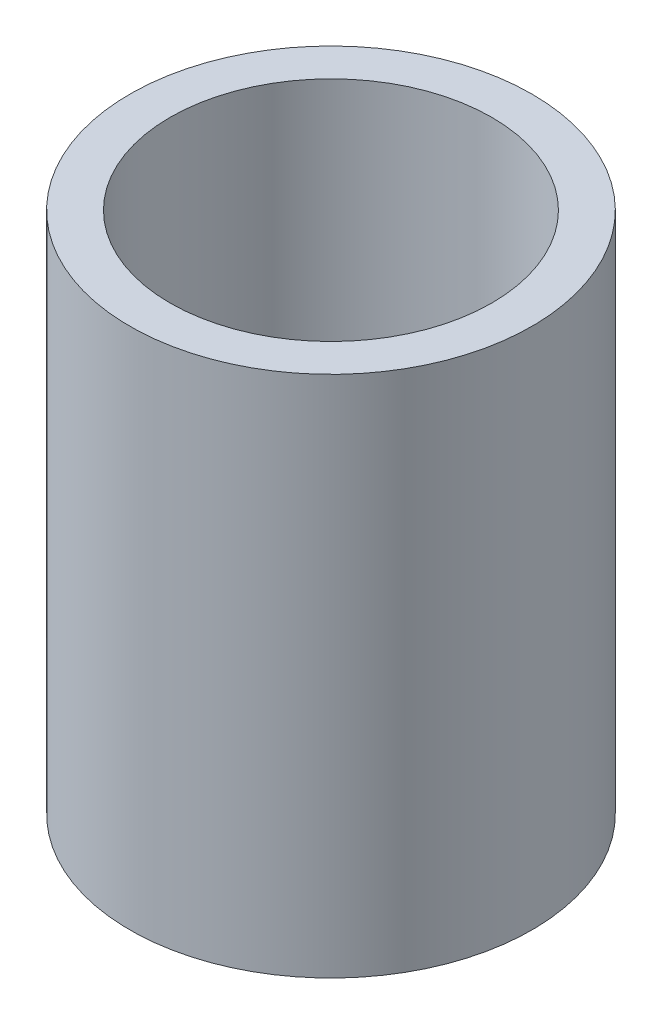
ISO-10303-21;
HEADER;
FILE_DESCRIPTION(('STEP AP214'),'2;1');
FILE_NAME('part.step','',(''),(''),'','','');
FILE_SCHEMA(('AUTOMOTIVE_DESIGN { 1 0 10303 214 1 1 1 1 }'));
ENDSEC;
DATA;
#1=APPLICATION_CONTEXT('core data for automotive mechanical design processes');
#2=APPLICATION_PROTOCOL_DEFINITION('international standard','automotive_design',2000,#1);
#3=PRODUCT_CONTEXT('',#1,'mechanical');
#4=PRODUCT('Part','Part','',(#3));
#5=PRODUCT_RELATED_PRODUCT_CATEGORY('part','',(#4));
#6=PRODUCT_DEFINITION_FORMATION('','',#4);
#7=PRODUCT_DEFINITION_CONTEXT('part definition',#1,'design');
#8=PRODUCT_DEFINITION('design','',#6,#7);
#9=PRODUCT_DEFINITION_SHAPE('','',#8);
#10=(LENGTH_UNIT() NAMED_UNIT(*) SI_UNIT(.MILLI.,.METRE.));
#11=(NAMED_UNIT(*) PLANE_ANGLE_UNIT() SI_UNIT($,.RADIAN.));
#12=(NAMED_UNIT(*) SI_UNIT($,.STERADIAN.) SOLID_ANGLE_UNIT());
#13=UNCERTAINTY_MEASURE_WITH_UNIT(LENGTH_MEASURE(1.E-05),#10,'distance_accuracy_value','');
#14=(GEOMETRIC_REPRESENTATION_CONTEXT(3) GLOBAL_UNCERTAINTY_ASSIGNED_CONTEXT((#13)) GLOBAL_UNIT_ASSIGNED_CONTEXT((#10,
#11,#12)) REPRESENTATION_CONTEXT('',''));
#15=CARTESIAN_POINT('',(0.,0.,0.));
#16=DIRECTION('',(0.,0.,1.));
#17=DIRECTION('',(1.,0.,0.));
#18=AXIS2_PLACEMENT_3D('',#15,#16,#17);
#19=CARTESIAN_POINT('',(0.,13.,0.));
#20=DIRECTION('',(0.,1.,0.));
#21=DIRECTION('',(0.,0.,1.));
#22=AXIS2_PLACEMENT_3D('',#19,#20,#21);
#23=PLANE('',#22);
#24=CARTESIAN_POINT('',(0.,13.,0.));
#25=DIRECTION('',(0.,1.,0.));
#26=DIRECTION('',(0.,0.,1.));
#27=AXIS2_PLACEMENT_3D('',#24,#25,#26);
#28=CIRCLE('',#27,5.);
#29=CARTESIAN_POINT('',(0.,13.,-5.));
#30=VERTEX_POINT('',#29);
#31=EDGE_CURVE('E10',#30,#30,#28,.T.);
#32=ORIENTED_EDGE('',*,*,#31,.T.);
#33=EDGE_LOOP('',(#32));
#34=FACE_BOUND('',#33,.T.);
#35=CARTESIAN_POINT('',(0.,13.,0.));
#36=DIRECTION('',(0.,1.,0.));
#37=DIRECTION('',(0.,0.,1.));
#38=AXIS2_PLACEMENT_3D('',#35,#36,#37);
#39=CIRCLE('',#38,4.);
#40=CARTESIAN_POINT('',(0.,13.,-4.));
#41=VERTEX_POINT('',#40);
#42=EDGE_CURVE('E41',#41,#41,#39,.T.);
#43=ORIENTED_EDGE('',*,*,#42,.F.);
#44=EDGE_LOOP('',(#43));
#45=FACE_BOUND('',#44,.T.);
#46=ADVANCED_FACE('F30',(#34,#45),#23,.T.);
#47=CARTESIAN_POINT('',(0.,0.,0.));
#48=DIRECTION('',(0.,1.,0.));
#49=DIRECTION('',(0.,0.,1.));
#50=AXIS2_PLACEMENT_3D('',#47,#48,#49);
#51=PLANE('',#50);
#52=CARTESIAN_POINT('',(0.,0.,0.));
#53=DIRECTION('',(0.,1.,0.));
#54=DIRECTION('',(0.,0.,1.));
#55=AXIS2_PLACEMENT_3D('',#52,#53,#54);
#56=CIRCLE('',#55,5.);
#57=CARTESIAN_POINT('',(0.,0.,-5.));
#58=VERTEX_POINT('',#57);
#59=EDGE_CURVE('E34',#58,#58,#56,.T.);
#60=ORIENTED_EDGE('',*,*,#59,.F.);
#61=EDGE_LOOP('',(#60));
#62=FACE_BOUND('',#61,.T.);
#63=CARTESIAN_POINT('',(0.,0.,0.));
#64=DIRECTION('',(0.,1.,0.));
#65=DIRECTION('',(0.,0.,1.));
#66=AXIS2_PLACEMENT_3D('',#63,#64,#65);
#67=CIRCLE('',#66,4.);
#68=CARTESIAN_POINT('',(0.,0.,-4.));
#69=VERTEX_POINT('',#68);
#70=EDGE_CURVE('E43',#69,#69,#67,.T.);
#71=ORIENTED_EDGE('',*,*,#70,.T.);
#72=EDGE_LOOP('',(#71));
#73=FACE_BOUND('',#72,.T.);
#74=ADVANCED_FACE('F53',(#62,#73),#51,.F.);
#75=CARTESIAN_POINT('',(0.,13.,0.));
#76=DIRECTION('',(0.,-1.,0.));
#77=DIRECTION('',(0.,0.,-1.));
#78=AXIS2_PLACEMENT_3D('',#75,#76,#77);
#79=CYLINDRICAL_SURFACE('',#78,5.);
#80=CARTESIAN_POINT('',(0.,13.,-5.));
#81=CARTESIAN_POINT('',(0.,12.8645833333333,-5.));
#82=CARTESIAN_POINT('',(0.,12.7291666666667,-5.));
#83=CARTESIAN_POINT('',(0.,12.4583333333333,-5.));
#84=CARTESIAN_POINT('',(0.,12.3229166666667,-5.));
#85=CARTESIAN_POINT('',(0.,12.0520833333333,-5.));
#86=CARTESIAN_POINT('',(0.,11.9166666666667,-5.));
#87=CARTESIAN_POINT('',(0.,11.6458333333333,-5.));
#88=CARTESIAN_POINT('',(0.,11.5104166666667,-5.));
#89=CARTESIAN_POINT('',(0.,11.2395833333333,-5.));
#90=CARTESIAN_POINT('',(0.,11.1041666666667,-5.));
#91=CARTESIAN_POINT('',(0.,10.8333333333333,-5.));
#92=CARTESIAN_POINT('',(0.,10.6979166666667,-5.));
#93=CARTESIAN_POINT('',(0.,10.4270833333333,-5.));
#94=CARTESIAN_POINT('',(0.,10.2916666666667,-5.));
#95=CARTESIAN_POINT('',(0.,10.0208333333333,-5.));
#96=CARTESIAN_POINT('',(0.,9.88541666666667,-5.));
#97=CARTESIAN_POINT('',(0.,9.61458333333333,-5.));
#98=CARTESIAN_POINT('',(0.,9.47916666666667,-5.));
#99=CARTESIAN_POINT('',(0.,9.20833333333333,-5.));
#100=CARTESIAN_POINT('',(0.,9.07291666666667,-5.));
#101=CARTESIAN_POINT('',(0.,8.80208333333333,-5.));
#102=CARTESIAN_POINT('',(0.,8.66666666666667,-5.));
#103=CARTESIAN_POINT('',(0.,8.39583333333333,-5.));
#104=CARTESIAN_POINT('',(0.,8.26041666666667,-5.));
#105=CARTESIAN_POINT('',(0.,7.98958333333333,-5.));
#106=CARTESIAN_POINT('',(0.,7.85416666666667,-5.));
#107=CARTESIAN_POINT('',(0.,7.58333333333333,-5.));
#108=CARTESIAN_POINT('',(0.,7.44791666666667,-5.));
#109=CARTESIAN_POINT('',(0.,7.17708333333333,-5.));
#110=CARTESIAN_POINT('',(0.,7.04166666666667,-5.));
#111=CARTESIAN_POINT('',(0.,6.77083333333333,-5.));
#112=CARTESIAN_POINT('',(0.,6.63541666666667,-5.));
#113=CARTESIAN_POINT('',(0.,6.36458333333333,-5.));
#114=CARTESIAN_POINT('',(0.,6.22916666666667,-5.));
#115=CARTESIAN_POINT('',(0.,5.95833333333333,-5.));
#116=CARTESIAN_POINT('',(0.,5.82291666666667,-5.));
#117=CARTESIAN_POINT('',(0.,5.55208333333333,-5.));
#118=CARTESIAN_POINT('',(0.,5.41666666666667,-5.));
#119=CARTESIAN_POINT('',(0.,5.14583333333333,-5.));
#120=CARTESIAN_POINT('',(0.,5.01041666666667,-5.));
#121=CARTESIAN_POINT('',(0.,4.73958333333333,-5.));
#122=CARTESIAN_POINT('',(0.,4.60416666666667,-5.));
#123=CARTESIAN_POINT('',(0.,4.33333333333333,-5.));
#124=CARTESIAN_POINT('',(0.,4.19791666666667,-5.));
#125=CARTESIAN_POINT('',(0.,3.92708333333333,-5.));
#126=CARTESIAN_POINT('',(0.,3.79166666666667,-5.));
#127=CARTESIAN_POINT('',(0.,3.52083333333333,-5.));
#128=CARTESIAN_POINT('',(0.,3.38541666666667,-5.));
#129=CARTESIAN_POINT('',(0.,3.11458333333333,-5.));
#130=CARTESIAN_POINT('',(0.,2.97916666666667,-5.));
#131=CARTESIAN_POINT('',(0.,2.70833333333333,-5.));
#132=CARTESIAN_POINT('',(0.,2.57291666666667,-5.));
#133=CARTESIAN_POINT('',(0.,2.30208333333333,-5.));
#134=CARTESIAN_POINT('',(0.,2.16666666666667,-5.));
#135=CARTESIAN_POINT('',(0.,1.89583333333333,-5.));
#136=CARTESIAN_POINT('',(0.,1.76041666666667,-5.));
#137=CARTESIAN_POINT('',(0.,1.48958333333333,-5.));
#138=CARTESIAN_POINT('',(0.,1.35416666666667,-5.));
#139=CARTESIAN_POINT('',(0.,1.08333333333333,-5.));
#140=CARTESIAN_POINT('',(0.,0.947916666666667,-5.));
#141=CARTESIAN_POINT('',(0.,0.677083333333334,-5.));
#142=CARTESIAN_POINT('',(0.,0.541666666666667,-5.));
#143=CARTESIAN_POINT('',(0.,0.270833333333334,-5.));
#144=CARTESIAN_POINT('',(0.,0.135416666666667,-5.));
#145=CARTESIAN_POINT('',(0.,0.,-5.));
#146=B_SPLINE_CURVE_WITH_KNOTS('',3,(#80,#81,#82,#83,#84,#85,#86,#87,#88,#89,#90,#91,#92,#93,
#94,#95,#96,#97,#98,#99,#100,#101,#102,#103,#104,#105,#106,#107,#108,#109,#110,#111,#112,#113,
#114,#115,#116,#117,#118,#119,#120,#121,#122,#123,#124,#125,#126,#127,#128,#129,#130,#131,#132,
#133,#134,#135,#136,#137,#138,#139,#140,#141,#142,#143,#144,#145),.UNSPECIFIED.,.F.,.F.,(4,2,2,
2,2,2,2,2,2,2,2,2,2,2,2,2,2,2,2,2,2,2,2,2,2,2,2,2,2,2,2,2,4),(0.,0.406249999999999,
0.812499999999999,1.21875,1.625,2.03125,2.4375,2.84375,3.25,3.65625,4.0625,4.46875,4.875,
5.28125,5.6875,6.09375,6.5,6.90625,7.3125,7.71875,8.125,8.53125,8.9375,9.34375,9.75,10.15625,
10.5625,10.96875,11.375,11.78125,12.1875,12.59375,13.),.UNSPECIFIED.);
#147=EDGE_CURVE('BSEAM32',#30,#58,#146,.T.);
#148=ORIENTED_EDGE('',*,*,#31,.F.);
#149=ORIENTED_EDGE('',*,*,#59,.T.);
#150=ORIENTED_EDGE('',*,*,#147,.T.);
#151=ORIENTED_EDGE('',*,*,#147,.F.);
#152=EDGE_LOOP('',(#148,#150,#149,#151));
#153=FACE_BOUND('',#152,.T.);
#154=ADVANCED_FACE('F32',(#153),#79,.T.);
#155=CARTESIAN_POINT('',(0.,13.,0.));
#156=DIRECTION('',(0.,-1.,0.));
#157=DIRECTION('',(0.,0.,-1.));
#158=AXIS2_PLACEMENT_3D('',#155,#156,#157);
#159=CYLINDRICAL_SURFACE('',#158,4.);
#160=CARTESIAN_POINT('',(0.,13.,-4.));
#161=CARTESIAN_POINT('',(0.,12.8645833333333,-4.));
#162=CARTESIAN_POINT('',(0.,12.7291666666667,-4.));
#163=CARTESIAN_POINT('',(0.,12.4583333333333,-4.));
#164=CARTESIAN_POINT('',(0.,12.3229166666667,-4.));
#165=CARTESIAN_POINT('',(0.,12.0520833333333,-4.));
#166=CARTESIAN_POINT('',(0.,11.9166666666667,-4.));
#167=CARTESIAN_POINT('',(0.,11.6458333333333,-4.));
#168=CARTESIAN_POINT('',(0.,11.5104166666667,-4.));
#169=CARTESIAN_POINT('',(0.,11.2395833333333,-4.));
#170=CARTESIAN_POINT('',(0.,11.1041666666667,-4.));
#171=CARTESIAN_POINT('',(0.,10.8333333333333,-4.));
#172=CARTESIAN_POINT('',(0.,10.6979166666667,-4.));
#173=CARTESIAN_POINT('',(0.,10.4270833333333,-4.));
#174=CARTESIAN_POINT('',(0.,10.2916666666667,-4.));
#175=CARTESIAN_POINT('',(0.,10.0208333333333,-4.));
#176=CARTESIAN_POINT('',(0.,9.88541666666667,-4.));
#177=CARTESIAN_POINT('',(0.,9.61458333333333,-4.));
#178=CARTESIAN_POINT('',(0.,9.47916666666667,-4.));
#179=CARTESIAN_POINT('',(0.,9.20833333333333,-4.));
#180=CARTESIAN_POINT('',(0.,9.07291666666667,-4.));
#181=CARTESIAN_POINT('',(0.,8.80208333333333,-4.));
#182=CARTESIAN_POINT('',(0.,8.66666666666667,-4.));
#183=CARTESIAN_POINT('',(0.,8.39583333333333,-4.));
#184=CARTESIAN_POINT('',(0.,8.26041666666667,-4.));
#185=CARTESIAN_POINT('',(0.,7.98958333333333,-4.));
#186=CARTESIAN_POINT('',(0.,7.85416666666667,-4.));
#187=CARTESIAN_POINT('',(0.,7.58333333333333,-4.));
#188=CARTESIAN_POINT('',(0.,7.44791666666667,-4.));
#189=CARTESIAN_POINT('',(0.,7.17708333333333,-4.));
#190=CARTESIAN_POINT('',(0.,7.04166666666667,-4.));
#191=CARTESIAN_POINT('',(0.,6.77083333333333,-4.));
#192=CARTESIAN_POINT('',(0.,6.63541666666667,-4.));
#193=CARTESIAN_POINT('',(0.,6.36458333333333,-4.));
#194=CARTESIAN_POINT('',(0.,6.22916666666667,-4.));
#195=CARTESIAN_POINT('',(0.,5.95833333333333,-4.));
#196=CARTESIAN_POINT('',(0.,5.82291666666667,-4.));
#197=CARTESIAN_POINT('',(0.,5.55208333333333,-4.));
#198=CARTESIAN_POINT('',(0.,5.41666666666667,-4.));
#199=CARTESIAN_POINT('',(0.,5.14583333333333,-4.));
#200=CARTESIAN_POINT('',(0.,5.01041666666667,-4.));
#201=CARTESIAN_POINT('',(0.,4.73958333333333,-4.));
#202=CARTESIAN_POINT('',(0.,4.60416666666667,-4.));
#203=CARTESIAN_POINT('',(0.,4.33333333333333,-4.));
#204=CARTESIAN_POINT('',(0.,4.19791666666667,-4.));
#205=CARTESIAN_POINT('',(0.,3.92708333333333,-4.));
#206=CARTESIAN_POINT('',(0.,3.79166666666667,-4.));
#207=CARTESIAN_POINT('',(0.,3.52083333333333,-4.));
#208=CARTESIAN_POINT('',(0.,3.38541666666667,-4.));
#209=CARTESIAN_POINT('',(0.,3.11458333333333,-4.));
#210=CARTESIAN_POINT('',(0.,2.97916666666667,-4.));
#211=CARTESIAN_POINT('',(0.,2.70833333333333,-4.));
#212=CARTESIAN_POINT('',(0.,2.57291666666667,-4.));
#213=CARTESIAN_POINT('',(0.,2.30208333333333,-4.));
#214=CARTESIAN_POINT('',(0.,2.16666666666667,-4.));
#215=CARTESIAN_POINT('',(0.,1.89583333333333,-4.));
#216=CARTESIAN_POINT('',(0.,1.76041666666667,-4.));
#217=CARTESIAN_POINT('',(0.,1.48958333333333,-4.));
#218=CARTESIAN_POINT('',(0.,1.35416666666667,-4.));
#219=CARTESIAN_POINT('',(0.,1.08333333333333,-4.));
#220=CARTESIAN_POINT('',(0.,0.947916666666667,-4.));
#221=CARTESIAN_POINT('',(0.,0.677083333333334,-4.));
#222=CARTESIAN_POINT('',(0.,0.541666666666667,-4.));
#223=CARTESIAN_POINT('',(0.,0.270833333333334,-4.));
#224=CARTESIAN_POINT('',(0.,0.135416666666667,-4.));
#225=CARTESIAN_POINT('',(0.,0.,-4.));
#226=B_SPLINE_CURVE_WITH_KNOTS('',3,(#160,#161,#162,#163,#164,#165,#166,#167,#168,#169,#170,
#171,#172,#173,#174,#175,#176,#177,#178,#179,#180,#181,#182,#183,#184,#185,#186,#187,#188,#189,
#190,#191,#192,#193,#194,#195,#196,#197,#198,#199,#200,#201,#202,#203,#204,#205,#206,#207,#208,
#209,#210,#211,#212,#213,#214,#215,#216,#217,#218,#219,#220,#221,#222,#223,#224,#225),
.UNSPECIFIED.,.F.,.F.,(4,2,2,2,2,2,2,2,2,2,2,2,2,2,2,2,2,2,2,2,2,2,2,2,2,2,2,2,2,2,2,2,4),(0.,
0.406249999999999,0.812499999999999,1.21875,1.625,2.03125,2.4375,2.84375,3.25,3.65625,4.0625,
4.46875,4.875,5.28125,5.6875,6.09375,6.5,6.90625,7.3125,7.71875,8.125,8.53125,8.9375,9.34375,
9.75,10.15625,10.5625,10.96875,11.375,11.78125,12.1875,12.59375,13.),.UNSPECIFIED.);
#227=EDGE_CURVE('BSEAM49',#41,#69,#226,.T.);
#228=ORIENTED_EDGE('',*,*,#42,.T.);
#229=ORIENTED_EDGE('',*,*,#70,.F.);
#230=ORIENTED_EDGE('',*,*,#227,.T.);
#231=ORIENTED_EDGE('',*,*,#227,.F.);
#232=EDGE_LOOP('',(#228,#230,#229,#231));
#233=FACE_BOUND('',#232,.T.);
#234=ADVANCED_FACE('F49',(#233),#159,.F.);
#235=CLOSED_SHELL('',(#46,#74,#154,#234));
#236=MANIFOLD_SOLID_BREP('B2',#235);
#237=ADVANCED_BREP_SHAPE_REPRESENTATION('',(#18,#236),#14);
#238=SHAPE_DEFINITION_REPRESENTATION(#9,#237);
ENDSEC;
END-ISO-10303-21;
